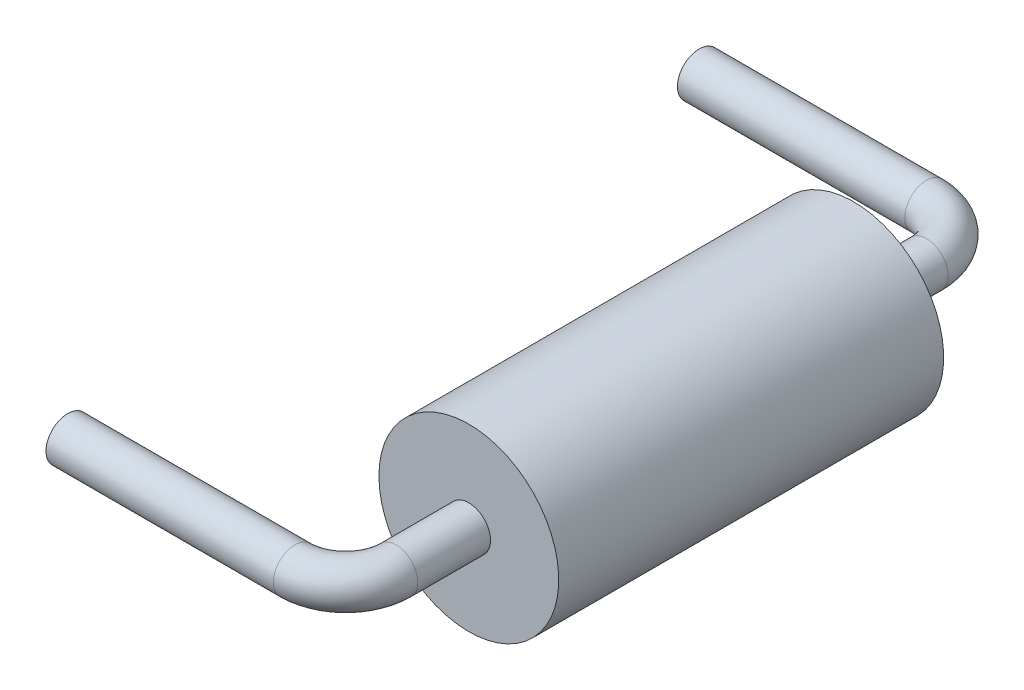
ISO-10303-21;
HEADER;
FILE_DESCRIPTION(('STEP AP214'),'2;1');
FILE_NAME('part.step','',(''),(''),'','','');
FILE_SCHEMA(('AUTOMOTIVE_DESIGN { 1 0 10303 214 1 1 1 1 }'));
ENDSEC;
DATA;
#1=APPLICATION_CONTEXT('core data for automotive mechanical design processes');
#2=APPLICATION_PROTOCOL_DEFINITION('international standard','automotive_design',2000,#1);
#3=PRODUCT_CONTEXT('',#1,'mechanical');
#4=PRODUCT('Part','Part','',(#3));
#5=PRODUCT_RELATED_PRODUCT_CATEGORY('part','',(#4));
#6=PRODUCT_DEFINITION_FORMATION('','',#4);
#7=PRODUCT_DEFINITION_CONTEXT('part definition',#1,'design');
#8=PRODUCT_DEFINITION('design','',#6,#7);
#9=PRODUCT_DEFINITION_SHAPE('','',#8);
#10=(LENGTH_UNIT() NAMED_UNIT(*) SI_UNIT(.MILLI.,.METRE.));
#11=(NAMED_UNIT(*) PLANE_ANGLE_UNIT() SI_UNIT($,.RADIAN.));
#12=(NAMED_UNIT(*) SI_UNIT($,.STERADIAN.) SOLID_ANGLE_UNIT());
#13=UNCERTAINTY_MEASURE_WITH_UNIT(LENGTH_MEASURE(1.E-05),#10,'distance_accuracy_value','');
#14=(GEOMETRIC_REPRESENTATION_CONTEXT(3) GLOBAL_UNCERTAINTY_ASSIGNED_CONTEXT((#13)) GLOBAL_UNIT_ASSIGNED_CONTEXT((#10,
#11,#12)) REPRESENTATION_CONTEXT('',''));
#15=CARTESIAN_POINT('',(0.,0.,0.));
#16=DIRECTION('',(0.,0.,1.));
#17=DIRECTION('',(1.,0.,0.));
#18=AXIS2_PLACEMENT_3D('',#15,#16,#17);
#19=CARTESIAN_POINT('',(-5.5,0.,6.25));
#20=DIRECTION('',(-1.,0.,0.));
#21=DIRECTION('',(0.,0.,1.));
#22=AXIS2_PLACEMENT_3D('',#19,#20,#21);
#23=PLANE('',#22);
#24=CARTESIAN_POINT('',(-5.5,0.,6.25));
#25=DIRECTION('',(-1.,0.,0.));
#26=DIRECTION('',(0.,-1.,0.));
#27=AXIS2_PLACEMENT_3D('',#24,#25,#26);
#28=CIRCLE('',#27,0.43);
#29=CARTESIAN_POINT('',(-5.5,-0.43,6.25));
#30=VERTEX_POINT('',#29);
#31=EDGE_CURVE('E18',#30,#30,#28,.F.);
#32=ORIENTED_EDGE('',*,*,#31,.F.);
#33=EDGE_LOOP('',(#32));
#34=FACE_BOUND('',#33,.T.);
#35=ADVANCED_FACE('F15',(#34),#23,.T.);
#36=CARTESIAN_POINT('',(-5.5,0.,-6.25));
#37=DIRECTION('',(-1.,0.,0.));
#38=DIRECTION('',(0.,0.,1.));
#39=AXIS2_PLACEMENT_3D('',#36,#37,#38);
#40=PLANE('',#39);
#41=CARTESIAN_POINT('',(-5.5,0.,-6.25));
#42=DIRECTION('',(-1.,0.,0.));
#43=DIRECTION('',(0.,-1.,0.));
#44=AXIS2_PLACEMENT_3D('',#41,#42,#43);
#45=CIRCLE('',#44,0.43);
#46=CARTESIAN_POINT('',(-5.5,-0.43,-6.25));
#47=VERTEX_POINT('',#46);
#48=EDGE_CURVE('E38',#47,#47,#45,.F.);
#49=ORIENTED_EDGE('',*,*,#48,.F.);
#50=EDGE_LOOP('',(#49));
#51=FACE_BOUND('',#50,.T.);
#52=ADVANCED_FACE('F50',(#51),#40,.T.);
#53=CARTESIAN_POINT('',(-1.,0.,6.25));
#54=DIRECTION('',(-1.,0.,0.));
#55=DIRECTION('',(0.,-1.,0.));
#56=AXIS2_PLACEMENT_3D('',#53,#54,#55);
#57=CYLINDRICAL_SURFACE('',#56,0.43);
#58=CARTESIAN_POINT('',(-1.,0.,6.25));
#59=DIRECTION('',(-1.,0.,0.));
#60=DIRECTION('',(0.,0.,1.));
#61=AXIS2_PLACEMENT_3D('',#58,#59,#60);
#62=CIRCLE('',#61,0.43);
#63=CARTESIAN_POINT('',(-1.,0.,6.68));
#64=VERTEX_POINT('',#63);
#65=EDGE_CURVE('E30',#64,#64,#62,.F.);
#66=ORIENTED_EDGE('',*,*,#65,.F.);
#67=EDGE_LOOP('',(#66));
#68=FACE_BOUND('',#67,.T.);
#69=ORIENTED_EDGE('',*,*,#31,.T.);
#70=EDGE_LOOP('',(#69));
#71=FACE_BOUND('',#70,.T.);
#72=ADVANCED_FACE('F47',(#68,#71),#57,.T.);
#73=CARTESIAN_POINT('',(-1.,0.,-6.25));
#74=DIRECTION('',(-1.,0.,0.));
#75=DIRECTION('',(0.,-1.,0.));
#76=AXIS2_PLACEMENT_3D('',#73,#74,#75);
#77=CYLINDRICAL_SURFACE('',#76,0.43);
#78=ORIENTED_EDGE('',*,*,#48,.T.);
#79=EDGE_LOOP('',(#78));
#80=FACE_BOUND('',#79,.T.);
#81=CARTESIAN_POINT('',(-1.,0.,-6.25));
#82=DIRECTION('',(-1.,0.,0.));
#83=DIRECTION('',(0.,0.,-1.));
#84=AXIS2_PLACEMENT_3D('',#81,#82,#83);
#85=CIRCLE('',#84,0.43);
#86=CARTESIAN_POINT('',(-1.,0.,-6.68));
#87=VERTEX_POINT('',#86);
#88=EDGE_CURVE('E43',#87,#87,#85,.F.);
#89=ORIENTED_EDGE('',*,*,#88,.F.);
#90=EDGE_LOOP('',(#89));
#91=FACE_BOUND('',#90,.T.);
#92=ADVANCED_FACE('F97',(#80,#91),#77,.T.);
#93=CARTESIAN_POINT('',(-1.,0.,5.25));
#94=DIRECTION('',(0.,-1.,0.));
#95=DIRECTION('',(0.,0.,-1.));
#96=AXIS2_PLACEMENT_3D('',#93,#94,#95);
#97=TOROIDAL_SURFACE('',#96,1.,0.43);
#98=CARTESIAN_POINT('',(0.,0.,5.25));
#99=DIRECTION('',(0.,0.,-1.));
#100=DIRECTION('',(-1.,0.,0.));
#101=AXIS2_PLACEMENT_3D('',#98,#99,#100);
#102=CIRCLE('',#101,0.43);
#103=CARTESIAN_POINT('',(-0.43,0.,5.25));
#104=VERTEX_POINT('',#103);
#105=EDGE_CURVE('E90',#104,#104,#102,.T.);
#106=ORIENTED_EDGE('',*,*,#105,.F.);
#107=EDGE_LOOP('',(#106));
#108=FACE_BOUND('',#107,.T.);
#109=ORIENTED_EDGE('',*,*,#65,.T.);
#110=EDGE_LOOP('',(#109));
#111=FACE_BOUND('',#110,.T.);
#112=ADVANCED_FACE('F83',(#108,#111),#97,.T.);
#113=CARTESIAN_POINT('',(-1.,0.,-5.25));
#114=DIRECTION('',(0.,1.,0.));
#115=DIRECTION('',(0.,0.,1.));
#116=AXIS2_PLACEMENT_3D('',#113,#114,#115);
#117=TOROIDAL_SURFACE('',#116,1.,0.43);
#118=CARTESIAN_POINT('',(0.,0.,-5.25));
#119=DIRECTION('',(0.,0.,1.));
#120=DIRECTION('',(1.,0.,0.));
#121=AXIS2_PLACEMENT_3D('',#118,#119,#120);
#122=CIRCLE('',#121,0.43);
#123=CARTESIAN_POINT('',(0.43,0.,-5.25));
#124=VERTEX_POINT('',#123);
#125=EDGE_CURVE('E37',#124,#124,#122,.T.);
#126=ORIENTED_EDGE('',*,*,#125,.F.);
#127=EDGE_LOOP('',(#126));
#128=FACE_BOUND('',#127,.T.);
#129=ORIENTED_EDGE('',*,*,#88,.T.);
#130=EDGE_LOOP('',(#129));
#131=FACE_BOUND('',#130,.T.);
#132=ADVANCED_FACE('F78',(#128,#131),#117,.T.);
#133=CARTESIAN_POINT('',(0.,0.,5.25));
#134=DIRECTION('',(0.,0.,-1.));
#135=DIRECTION('',(-1.,0.,0.));
#136=AXIS2_PLACEMENT_3D('',#133,#134,#135);
#137=CYLINDRICAL_SURFACE('',#136,0.43);
#138=CARTESIAN_POINT('',(0.,0.,3.81));
#139=DIRECTION('',(0.,0.,-1.));
#140=DIRECTION('',(-1.,0.,0.));
#141=AXIS2_PLACEMENT_3D('',#138,#139,#140);
#142=CIRCLE('',#141,0.43);
#143=CARTESIAN_POINT('',(-0.43,0.,3.81));
#144=VERTEX_POINT('',#143);
#145=EDGE_CURVE('E35',#144,#144,#142,.T.);
#146=ORIENTED_EDGE('',*,*,#145,.F.);
#147=EDGE_LOOP('',(#146));
#148=FACE_BOUND('',#147,.T.);
#149=ORIENTED_EDGE('',*,*,#105,.T.);
#150=EDGE_LOOP('',(#149));
#151=FACE_BOUND('',#150,.T.);
#152=ADVANCED_FACE('F74',(#148,#151),#137,.T.);
#153=CARTESIAN_POINT('',(0.,0.,-5.25));
#154=DIRECTION('',(0.,0.,1.));
#155=DIRECTION('',(1.,0.,0.));
#156=AXIS2_PLACEMENT_3D('',#153,#154,#155);
#157=CYLINDRICAL_SURFACE('',#156,0.43);
#158=ORIENTED_EDGE('',*,*,#125,.T.);
#159=EDGE_LOOP('',(#158));
#160=FACE_BOUND('',#159,.T.);
#161=CARTESIAN_POINT('',(0.,0.,-3.81));
#162=DIRECTION('',(0.,0.,1.));
#163=DIRECTION('',(1.,0.,0.));
#164=AXIS2_PLACEMENT_3D('',#161,#162,#163);
#165=CIRCLE('',#164,0.43);
#166=CARTESIAN_POINT('',(0.43,0.,-3.81));
#167=VERTEX_POINT('',#166);
#168=EDGE_CURVE('E27',#167,#167,#165,.F.);
#169=ORIENTED_EDGE('',*,*,#168,.T.);
#170=EDGE_LOOP('',(#169));
#171=FACE_BOUND('',#170,.T.);
#172=ADVANCED_FACE('F70',(#160,#171),#157,.T.);
#173=CARTESIAN_POINT('',(0.,0.,3.81));
#174=DIRECTION('',(0.,0.,1.));
#175=DIRECTION('',(1.,0.,0.));
#176=AXIS2_PLACEMENT_3D('',#173,#174,#175);
#177=PLANE('',#176);
#178=CARTESIAN_POINT('',(0.,0.,3.81));
#179=DIRECTION('',(0.,0.,-1.));
#180=DIRECTION('',(-1.,0.,0.));
#181=AXIS2_PLACEMENT_3D('',#178,#179,#180);
#182=CIRCLE('',#181,1.78);
#183=CARTESIAN_POINT('',(-1.78,0.,3.81));
#184=VERTEX_POINT('',#183);
#185=EDGE_CURVE('E22',#184,#184,#182,.T.);
#186=ORIENTED_EDGE('',*,*,#185,.F.);
#187=EDGE_LOOP('',(#186));
#188=FACE_BOUND('',#187,.T.);
#189=ORIENTED_EDGE('',*,*,#145,.T.);
#190=EDGE_LOOP('',(#189));
#191=FACE_BOUND('',#190,.T.);
#192=ADVANCED_FACE('F63',(#188,#191),#177,.T.);
#193=CARTESIAN_POINT('',(0.,0.,-3.81));
#194=DIRECTION('',(0.,0.,1.));
#195=DIRECTION('',(1.,0.,0.));
#196=AXIS2_PLACEMENT_3D('',#193,#194,#195);
#197=PLANE('',#196);
#198=ORIENTED_EDGE('',*,*,#168,.F.);
#199=EDGE_LOOP('',(#198));
#200=FACE_BOUND('',#199,.T.);
#201=CARTESIAN_POINT('',(0.,0.,-3.81));
#202=DIRECTION('',(0.,0.,-1.));
#203=DIRECTION('',(-1.,0.,0.));
#204=AXIS2_PLACEMENT_3D('',#201,#202,#203);
#205=CIRCLE('',#204,1.78);
#206=CARTESIAN_POINT('',(-1.78,0.,-3.81));
#207=VERTEX_POINT('',#206);
#208=EDGE_CURVE('E10',#207,#207,#205,.F.);
#209=ORIENTED_EDGE('',*,*,#208,.F.);
#210=EDGE_LOOP('',(#209));
#211=FACE_BOUND('',#210,.T.);
#212=ADVANCED_FACE('F58',(#200,#211),#197,.F.);
#213=CARTESIAN_POINT('',(0.,0.,3.81));
#214=DIRECTION('',(0.,0.,-1.));
#215=DIRECTION('',(-1.,0.,0.));
#216=AXIS2_PLACEMENT_3D('',#213,#214,#215);
#217=CYLINDRICAL_SURFACE('',#216,1.78);
#218=ORIENTED_EDGE('',*,*,#208,.T.);
#219=EDGE_LOOP('',(#218));
#220=FACE_BOUND('',#219,.T.);
#221=ORIENTED_EDGE('',*,*,#185,.T.);
#222=EDGE_LOOP('',(#221));
#223=FACE_BOUND('',#222,.T.);
#224=ADVANCED_FACE('F56',(#220,#223),#217,.T.);
#225=CLOSED_SHELL('',(#35,#52,#72,#92,#112,#132,#152,#172,#192,#212,#224));
#226=MANIFOLD_SOLID_BREP('B1',#225);
#227=ADVANCED_BREP_SHAPE_REPRESENTATION('',(#18,#226),#14);
#228=SHAPE_DEFINITION_REPRESENTATION(#9,#227);
ENDSEC;
END-ISO-10303-21;
